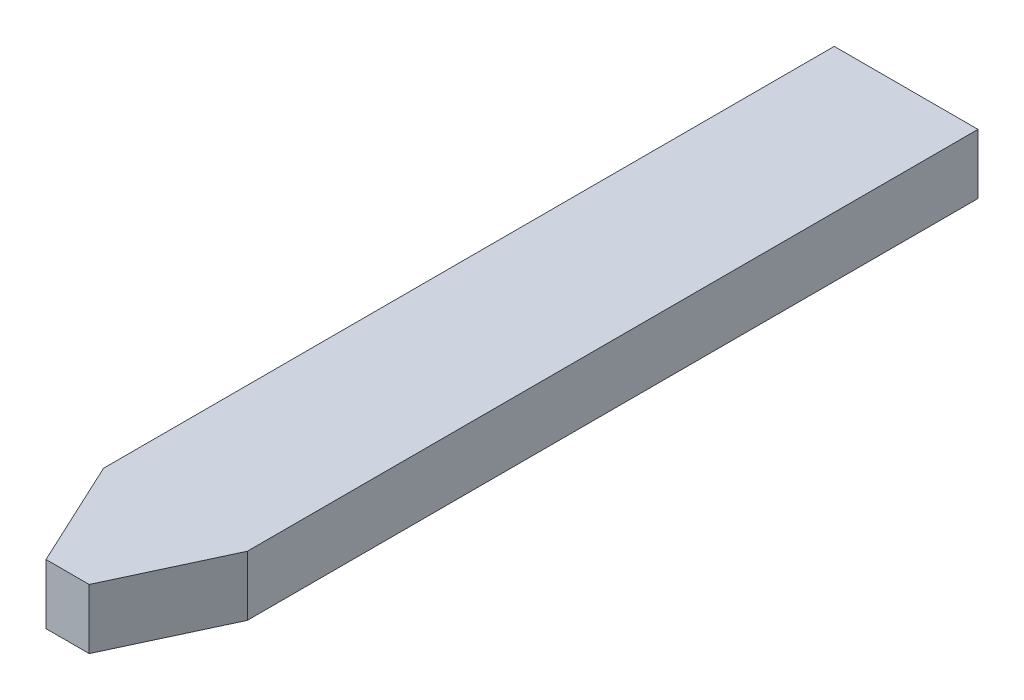
ISO-10303-21;
HEADER;
FILE_DESCRIPTION(('STEP AP214'),'2;1');
FILE_NAME('part.step','',(''),(''),'','','');
FILE_SCHEMA(('AUTOMOTIVE_DESIGN { 1 0 10303 214 1 1 1 1 }'));
ENDSEC;
DATA;
#1=APPLICATION_CONTEXT('core data for automotive mechanical design processes');
#2=APPLICATION_PROTOCOL_DEFINITION('international standard','automotive_design',2000,#1);
#3=PRODUCT_CONTEXT('',#1,'mechanical');
#4=PRODUCT('Part','Part','',(#3));
#5=PRODUCT_RELATED_PRODUCT_CATEGORY('part','',(#4));
#6=PRODUCT_DEFINITION_FORMATION('','',#4);
#7=PRODUCT_DEFINITION_CONTEXT('part definition',#1,'design');
#8=PRODUCT_DEFINITION('design','',#6,#7);
#9=PRODUCT_DEFINITION_SHAPE('','',#8);
#10=(LENGTH_UNIT() NAMED_UNIT(*) SI_UNIT(.MILLI.,.METRE.));
#11=(NAMED_UNIT(*) PLANE_ANGLE_UNIT() SI_UNIT($,.RADIAN.));
#12=(NAMED_UNIT(*) SI_UNIT($,.STERADIAN.) SOLID_ANGLE_UNIT());
#13=UNCERTAINTY_MEASURE_WITH_UNIT(LENGTH_MEASURE(1.E-05),#10,'distance_accuracy_value','');
#14=(GEOMETRIC_REPRESENTATION_CONTEXT(3) GLOBAL_UNCERTAINTY_ASSIGNED_CONTEXT((#13)) GLOBAL_UNIT_ASSIGNED_CONTEXT((#10,
#11,#12)) REPRESENTATION_CONTEXT('',''));
#15=CARTESIAN_POINT('',(0.,0.,0.));
#16=DIRECTION('',(0.,0.,1.));
#17=DIRECTION('',(1.,0.,0.));
#18=AXIS2_PLACEMENT_3D('',#15,#16,#17);
#19=CARTESIAN_POINT('',(0.3,0.125,3.5));
#20=DIRECTION('',(-1.,0.,0.));
#21=DIRECTION('',(0.,-1.,0.));
#22=AXIS2_PLACEMENT_3D('',#19,#20,#21);
#23=PLANE('',#22);
#24=DIRECTION('',(0.,0.,-1.));
#25=VECTOR('',#24,1.);
#26=CARTESIAN_POINT('',(0.3,0.125,3.5));
#27=LINE('',#26,#25);
#28=CARTESIAN_POINT('',(0.3,0.125,3.05));
#29=VERTEX_POINT('',#28);
#30=CARTESIAN_POINT('',(0.3,0.125,0.));
#31=VERTEX_POINT('',#30);
#32=EDGE_CURVE('E11',#29,#31,#27,.T.);
#33=ORIENTED_EDGE('',*,*,#32,.F.);
#34=DIRECTION('',(0.,-1.,0.));
#35=VECTOR('',#34,1.);
#36=CARTESIAN_POINT('',(0.3,-0.125,3.05));
#37=LINE('',#36,#35);
#38=CARTESIAN_POINT('',(0.3,-0.125,3.05));
#39=VERTEX_POINT('',#38);
#40=EDGE_CURVE('E24',#29,#39,#37,.T.);
#41=ORIENTED_EDGE('',*,*,#40,.T.);
#42=DIRECTION('',(0.,0.,-1.));
#43=VECTOR('',#42,1.);
#44=CARTESIAN_POINT('',(0.3,-0.125,3.5));
#45=LINE('',#44,#43);
#46=CARTESIAN_POINT('',(0.3,-0.125,0.));
#47=VERTEX_POINT('',#46);
#48=EDGE_CURVE('E115',#39,#47,#45,.T.);
#49=ORIENTED_EDGE('',*,*,#48,.T.);
#50=DIRECTION('',(0.,1.,0.));
#51=VECTOR('',#50,1.);
#52=CARTESIAN_POINT('',(0.3,0.125,0.));
#53=LINE('',#52,#51);
#54=EDGE_CURVE('E113',#47,#31,#53,.T.);
#55=ORIENTED_EDGE('',*,*,#54,.T.);
#56=EDGE_LOOP('',(#33,#41,#49,#55));
#57=FACE_BOUND('',#56,.T.);
#58=ADVANCED_FACE('F17',(#57),#23,.F.);
#59=CARTESIAN_POINT('',(-0.3,0.125,3.5));
#60=DIRECTION('',(0.,-1.,0.));
#61=DIRECTION('',(0.,0.,-1.));
#62=AXIS2_PLACEMENT_3D('',#59,#60,#61);
#63=PLANE('',#62);
#64=DIRECTION('',(-1.,0.,0.));
#65=VECTOR('',#64,1.);
#66=CARTESIAN_POINT('',(-0.3,0.125,3.5));
#67=LINE('',#66,#65);
#68=CARTESIAN_POINT('',(0.0901615538302503,0.125,3.5));
#69=VERTEX_POINT('',#68);
#70=CARTESIAN_POINT('',(-0.0901615538302505,0.125,3.5));
#71=VERTEX_POINT('',#70);
#72=EDGE_CURVE('E88',#69,#71,#67,.T.);
#73=ORIENTED_EDGE('',*,*,#72,.F.);
#74=DIRECTION('',(0.422618261740697,0.,-0.906307787036651));
#75=VECTOR('',#74,1.);
#76=CARTESIAN_POINT('',(0.0901615538302504,0.125,3.5));
#77=LINE('',#76,#75);
#78=EDGE_CURVE('E110',#69,#29,#77,.T.);
#79=ORIENTED_EDGE('',*,*,#78,.T.);
#80=ORIENTED_EDGE('',*,*,#32,.T.);
#81=DIRECTION('',(-1.,0.,0.));
#82=VECTOR('',#81,1.);
#83=CARTESIAN_POINT('',(-0.3,0.125,0.));
#84=LINE('',#83,#82);
#85=CARTESIAN_POINT('',(-0.3,0.125,0.));
#86=VERTEX_POINT('',#85);
#87=EDGE_CURVE('E108',#31,#86,#84,.T.);
#88=ORIENTED_EDGE('',*,*,#87,.T.);
#89=DIRECTION('',(0.,0.,-1.));
#90=VECTOR('',#89,1.);
#91=CARTESIAN_POINT('',(-0.3,0.125,3.5));
#92=LINE('',#91,#90);
#93=CARTESIAN_POINT('',(-0.3,0.125,3.05));
#94=VERTEX_POINT('',#93);
#95=EDGE_CURVE('E105',#94,#86,#92,.T.);
#96=ORIENTED_EDGE('',*,*,#95,.F.);
#97=DIRECTION('',(0.422618261740697,0.,0.906307787036651));
#98=VECTOR('',#97,1.);
#99=CARTESIAN_POINT('',(-0.0901615538302504,0.125,3.5));
#100=LINE('',#99,#98);
#101=EDGE_CURVE('E103',#94,#71,#100,.T.);
#102=ORIENTED_EDGE('',*,*,#101,.T.);
#103=EDGE_LOOP('',(#73,#79,#80,#88,#96,#102));
#104=FACE_BOUND('',#103,.T.);
#105=ADVANCED_FACE('F121',(#104),#63,.F.);
#106=CARTESIAN_POINT('',(-0.3,0.125,3.5));
#107=DIRECTION('',(1.,0.,0.));
#108=DIRECTION('',(0.,1.,0.));
#109=AXIS2_PLACEMENT_3D('',#106,#107,#108);
#110=PLANE('',#109);
#111=DIRECTION('',(0.,0.,-1.));
#112=VECTOR('',#111,1.);
#113=CARTESIAN_POINT('',(-0.3,-0.125,3.5));
#114=LINE('',#113,#112);
#115=CARTESIAN_POINT('',(-0.3,-0.125,3.05));
#116=VERTEX_POINT('',#115);
#117=CARTESIAN_POINT('',(-0.3,-0.125,0.));
#118=VERTEX_POINT('',#117);
#119=EDGE_CURVE('E101',#116,#118,#114,.T.);
#120=ORIENTED_EDGE('',*,*,#119,.F.);
#121=DIRECTION('',(0.,1.,0.));
#122=VECTOR('',#121,1.);
#123=CARTESIAN_POINT('',(-0.3,0.125,3.05));
#124=LINE('',#123,#122);
#125=EDGE_CURVE('E84',#116,#94,#124,.T.);
#126=ORIENTED_EDGE('',*,*,#125,.T.);
#127=ORIENTED_EDGE('',*,*,#95,.T.);
#128=DIRECTION('',(0.,-1.,0.));
#129=VECTOR('',#128,1.);
#130=CARTESIAN_POINT('',(-0.3,0.125,0.));
#131=LINE('',#130,#129);
#132=EDGE_CURVE('E97',#86,#118,#131,.T.);
#133=ORIENTED_EDGE('',*,*,#132,.T.);
#134=EDGE_LOOP('',(#120,#126,#127,#133));
#135=FACE_BOUND('',#134,.T.);
#136=ADVANCED_FACE('F123',(#135),#110,.F.);
#137=CARTESIAN_POINT('',(-0.3,-0.125,3.5));
#138=DIRECTION('',(0.,1.,0.));
#139=DIRECTION('',(0.,0.,1.));
#140=AXIS2_PLACEMENT_3D('',#137,#138,#139);
#141=PLANE('',#140);
#142=ORIENTED_EDGE('',*,*,#48,.F.);
#143=DIRECTION('',(-0.422618261740697,0.,0.906307787036651));
#144=VECTOR('',#143,1.);
#145=CARTESIAN_POINT('',(0.0901615538302505,-0.125,3.5));
#146=LINE('',#145,#144);
#147=CARTESIAN_POINT('',(0.0901615538302504,-0.125,3.5));
#148=VERTEX_POINT('',#147);
#149=EDGE_CURVE('E71',#39,#148,#146,.T.);
#150=ORIENTED_EDGE('',*,*,#149,.T.);
#151=DIRECTION('',(1.,0.,0.));
#152=VECTOR('',#151,1.);
#153=CARTESIAN_POINT('',(-0.3,-0.125,3.5));
#154=LINE('',#153,#152);
#155=CARTESIAN_POINT('',(-0.0901615538302504,-0.125,3.5));
#156=VERTEX_POINT('',#155);
#157=EDGE_CURVE('E65',#156,#148,#154,.T.);
#158=ORIENTED_EDGE('',*,*,#157,.F.);
#159=DIRECTION('',(-0.422618261740697,0.,-0.906307787036651));
#160=VECTOR('',#159,1.);
#161=CARTESIAN_POINT('',(-0.0901615538302504,-0.125,3.5));
#162=LINE('',#161,#160);
#163=EDGE_CURVE('E69',#156,#116,#162,.T.);
#164=ORIENTED_EDGE('',*,*,#163,.T.);
#165=ORIENTED_EDGE('',*,*,#119,.T.);
#166=DIRECTION('',(1.,0.,0.));
#167=VECTOR('',#166,1.);
#168=CARTESIAN_POINT('',(-0.3,-0.125,0.));
#169=LINE('',#168,#167);
#170=EDGE_CURVE('E85',#118,#47,#169,.T.);
#171=ORIENTED_EDGE('',*,*,#170,.T.);
#172=EDGE_LOOP('',(#142,#150,#158,#164,#165,#171));
#173=FACE_BOUND('',#172,.T.);
#174=ADVANCED_FACE('F68',(#173),#141,.F.);
#175=CARTESIAN_POINT('',(0.,0.,3.5));
#176=DIRECTION('',(0.,0.,1.));
#177=DIRECTION('',(1.,0.,0.));
#178=AXIS2_PLACEMENT_3D('',#175,#176,#177);
#179=PLANE('',#178);
#180=ORIENTED_EDGE('',*,*,#157,.T.);
#181=DIRECTION('',(0.,1.,0.));
#182=VECTOR('',#181,1.);
#183=CARTESIAN_POINT('',(0.0901615538302504,0.125,3.5));
#184=LINE('',#183,#182);
#185=EDGE_CURVE('E90',#148,#69,#184,.T.);
#186=ORIENTED_EDGE('',*,*,#185,.T.);
#187=ORIENTED_EDGE('',*,*,#72,.T.);
#188=DIRECTION('',(0.,-1.,0.));
#189=VECTOR('',#188,1.);
#190=CARTESIAN_POINT('',(-0.0901615538302504,-0.125,3.5));
#191=LINE('',#190,#189);
#192=EDGE_CURVE('E82',#71,#156,#191,.T.);
#193=ORIENTED_EDGE('',*,*,#192,.T.);
#194=EDGE_LOOP('',(#180,#186,#187,#193));
#195=FACE_BOUND('',#194,.T.);
#196=ADVANCED_FACE('F87',(#195),#179,.T.);
#197=CARTESIAN_POINT('',(0.,0.,0.));
#198=DIRECTION('',(0.,0.,1.));
#199=DIRECTION('',(1.,0.,0.));
#200=AXIS2_PLACEMENT_3D('',#197,#198,#199);
#201=PLANE('',#200);
#202=ORIENTED_EDGE('',*,*,#54,.F.);
#203=ORIENTED_EDGE('',*,*,#170,.F.);
#204=ORIENTED_EDGE('',*,*,#132,.F.);
#205=ORIENTED_EDGE('',*,*,#87,.F.);
#206=EDGE_LOOP('',(#202,#203,#204,#205));
#207=FACE_BOUND('',#206,.T.);
#208=ADVANCED_FACE('F127',(#207),#201,.F.);
#209=CARTESIAN_POINT('',(0.0901615538302505,0.,3.5));
#210=DIRECTION('',(0.906307787036651,0.,0.422618261740697));
#211=DIRECTION('',(0.,-1.,0.));
#212=AXIS2_PLACEMENT_3D('',#209,#210,#211);
#213=PLANE('',#212);
#214=ORIENTED_EDGE('',*,*,#149,.F.);
#215=ORIENTED_EDGE('',*,*,#40,.F.);
#216=ORIENTED_EDGE('',*,*,#78,.F.);
#217=ORIENTED_EDGE('',*,*,#185,.F.);
#218=EDGE_LOOP('',(#214,#215,#216,#217));
#219=FACE_BOUND('',#218,.T.);
#220=ADVANCED_FACE('F120',(#219),#213,.T.);
#221=CARTESIAN_POINT('',(-0.0901615538302504,0.,3.5));
#222=DIRECTION('',(-0.906307787036651,0.,0.422618261740697));
#223=DIRECTION('',(0.,1.,0.));
#224=AXIS2_PLACEMENT_3D('',#221,#222,#223);
#225=PLANE('',#224);
#226=ORIENTED_EDGE('',*,*,#101,.F.);
#227=ORIENTED_EDGE('',*,*,#125,.F.);
#228=ORIENTED_EDGE('',*,*,#163,.F.);
#229=ORIENTED_EDGE('',*,*,#192,.F.);
#230=EDGE_LOOP('',(#226,#227,#228,#229));
#231=FACE_BOUND('',#230,.T.);
#232=ADVANCED_FACE('F81',(#231),#225,.T.);
#233=CLOSED_SHELL('',(#58,#105,#136,#174,#196,#208,#220,#232));
#234=MANIFOLD_SOLID_BREP('B1',#233);
#235=ADVANCED_BREP_SHAPE_REPRESENTATION('',(#18,#234),#14);
#236=SHAPE_DEFINITION_REPRESENTATION(#9,#235);
ENDSEC;
END-ISO-10303-21;
